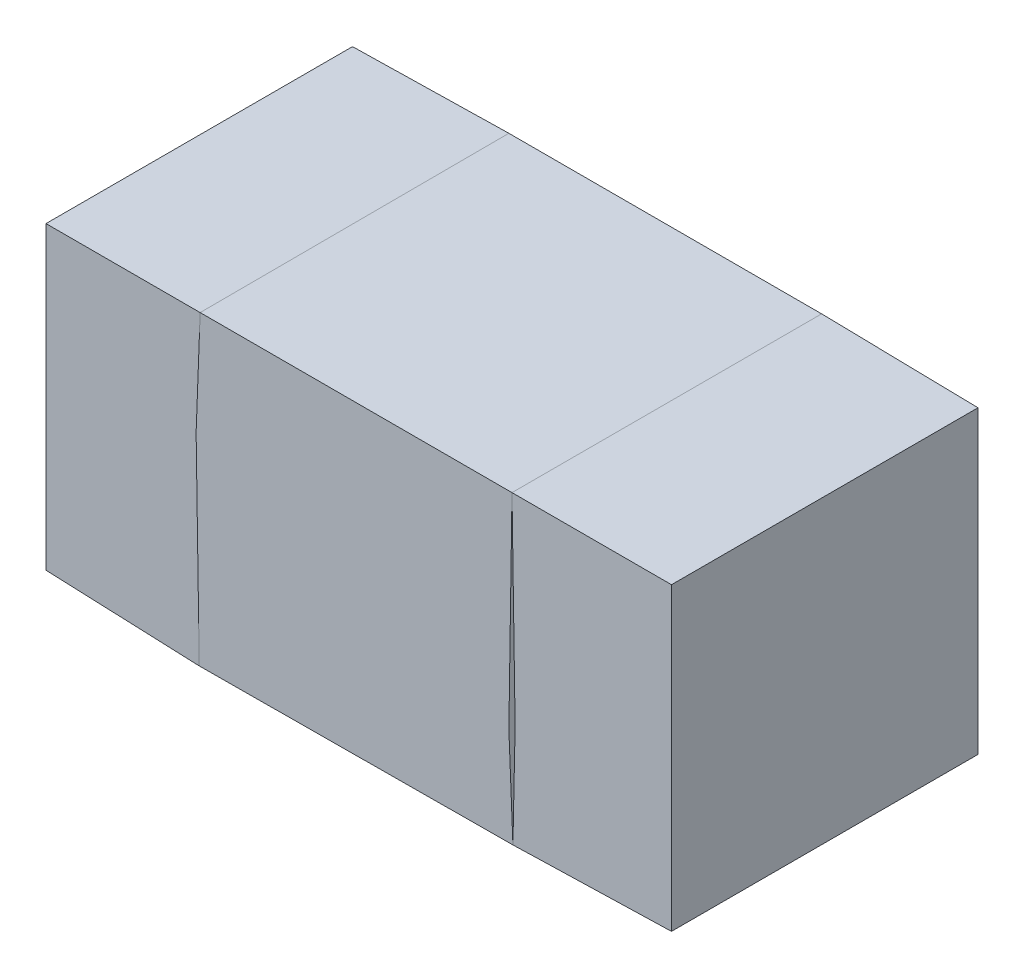
ISO-10303-21;
HEADER;
FILE_DESCRIPTION(('STEP AP214'),'2;1');
FILE_NAME('part.step','',(''),(''),'','','');
FILE_SCHEMA(('AUTOMOTIVE_DESIGN { 1 0 10303 214 1 1 1 1 }'));
ENDSEC;
DATA;
#1=APPLICATION_CONTEXT('core data for automotive mechanical design processes');
#2=APPLICATION_PROTOCOL_DEFINITION('international standard','automotive_design',2000,#1);
#3=PRODUCT_CONTEXT('',#1,'mechanical');
#4=PRODUCT('Part','Part','',(#3));
#5=PRODUCT_RELATED_PRODUCT_CATEGORY('part','',(#4));
#6=PRODUCT_DEFINITION_FORMATION('','',#4);
#7=PRODUCT_DEFINITION_CONTEXT('part definition',#1,'design');
#8=PRODUCT_DEFINITION('design','',#6,#7);
#9=PRODUCT_DEFINITION_SHAPE('','',#8);
#10=(LENGTH_UNIT() NAMED_UNIT(*) SI_UNIT(.MILLI.,.METRE.));
#11=(NAMED_UNIT(*) PLANE_ANGLE_UNIT() SI_UNIT($,.RADIAN.));
#12=(NAMED_UNIT(*) SI_UNIT($,.STERADIAN.) SOLID_ANGLE_UNIT());
#13=UNCERTAINTY_MEASURE_WITH_UNIT(LENGTH_MEASURE(1.E-05),#10,'distance_accuracy_value','');
#14=(GEOMETRIC_REPRESENTATION_CONTEXT(3) GLOBAL_UNCERTAINTY_ASSIGNED_CONTEXT((#13)) GLOBAL_UNIT_ASSIGNED_CONTEXT((#10,
#11,#12)) REPRESENTATION_CONTEXT('',''));
#15=CARTESIAN_POINT('',(0.,0.,0.));
#16=DIRECTION('',(0.,0.,1.));
#17=DIRECTION('',(1.,0.,0.));
#18=AXIS2_PLACEMENT_3D('',#15,#16,#17);
#19=CARTESIAN_POINT('',(0.,0.,0.49));
#20=DIRECTION('',(0.,0.,-1.));
#21=DIRECTION('',(0.,-1.,0.));
#22=AXIS2_PLACEMENT_3D('',#19,#20,#21);
#23=PLANE('',#22);
#24=DIRECTION('',(0.,-1.,0.));
#25=VECTOR('',#24,1.);
#26=CARTESIAN_POINT('',(-0.25,0.24,0.49));
#27=LINE('',#26,#25);
#28=CARTESIAN_POINT('',(-0.25,0.243535533905932,0.493535533905933));
#29=VERTEX_POINT('',#28);
#30=CARTESIAN_POINT('',(-0.25,-0.245,0.495));
#31=VERTEX_POINT('',#30);
#32=EDGE_CURVE('E146',#29,#31,#27,.T.);
#33=ORIENTED_EDGE('',*,*,#32,.F.);
#34=DIRECTION('',(1.,0.,0.));
#35=VECTOR('',#34,1.);
#36=CARTESIAN_POINT('',(-0.25,0.24,0.49));
#37=LINE('',#36,#35);
#38=CARTESIAN_POINT('',(-0.5,0.24,0.49));
#39=VERTEX_POINT('',#38);
#40=EDGE_CURVE('E99',#39,#29,#37,.T.);
#41=ORIENTED_EDGE('',*,*,#40,.F.);
#42=DIRECTION('',(0.,1.,0.));
#43=VECTOR('',#42,1.);
#44=CARTESIAN_POINT('',(-0.5,0.24,0.49));
#45=LINE('',#44,#43);
#46=CARTESIAN_POINT('',(-0.5,-0.24,0.49));
#47=VERTEX_POINT('',#46);
#48=EDGE_CURVE('E29',#47,#39,#45,.T.);
#49=ORIENTED_EDGE('',*,*,#48,.F.);
#50=DIRECTION('',(-1.,0.,0.));
#51=VECTOR('',#50,1.);
#52=CARTESIAN_POINT('',(-0.25,-0.24,0.49));
#53=LINE('',#52,#51);
#54=EDGE_CURVE('E11',#31,#47,#53,.T.);
#55=ORIENTED_EDGE('',*,*,#54,.F.);
#56=EDGE_LOOP('',(#33,#41,#49,#55));
#57=FACE_BOUND('',#56,.T.);
#58=ADVANCED_FACE('F16',(#57),#23,.F.);
#59=CARTESIAN_POINT('',(-0.25,-0.24,0.49));
#60=DIRECTION('',(0.,-1.,0.));
#61=DIRECTION('',(-1.,0.,0.));
#62=AXIS2_PLACEMENT_3D('',#59,#60,#61);
#63=PLANE('',#62);
#64=DIRECTION('',(-1.,0.,0.));
#65=VECTOR('',#64,1.);
#66=CARTESIAN_POINT('',(-0.25,-0.24,0.));
#67=LINE('',#66,#65);
#68=CARTESIAN_POINT('',(-0.25,-0.245,0.));
#69=VERTEX_POINT('',#68);
#70=CARTESIAN_POINT('',(-0.5,-0.24,0.));
#71=VERTEX_POINT('',#70);
#72=EDGE_CURVE('E117',#69,#71,#67,.T.);
#73=ORIENTED_EDGE('',*,*,#72,.F.);
#74=CARTESIAN_POINT('',(-0.25,-0.25,0.495));
#75=DIRECTION('',(0.,0.,-1.));
#76=VECTOR('',#75,1.);
#77=LINE('',#74,#76);
#78=EDGE_CURVE('E142',#31,#69,#77,.T.);
#79=ORIENTED_EDGE('',*,*,#78,.F.);
#80=ORIENTED_EDGE('',*,*,#54,.T.);
#81=DIRECTION('',(0.,0.,-1.));
#82=VECTOR('',#81,1.);
#83=CARTESIAN_POINT('',(-0.5,-0.24,0.49));
#84=LINE('',#83,#82);
#85=EDGE_CURVE('E130',#47,#71,#84,.T.);
#86=ORIENTED_EDGE('',*,*,#85,.T.);
#87=EDGE_LOOP('',(#73,#79,#80,#86));
#88=FACE_BOUND('',#87,.T.);
#89=ADVANCED_FACE('F274',(#88),#63,.T.);
#90=CARTESIAN_POINT('',(-0.5,0.24,0.49));
#91=DIRECTION('',(-1.,0.,0.));
#92=DIRECTION('',(0.,0.,1.));
#93=AXIS2_PLACEMENT_3D('',#90,#91,#92);
#94=PLANE('',#93);
#95=DIRECTION('',(0.,1.,0.));
#96=VECTOR('',#95,1.);
#97=CARTESIAN_POINT('',(-0.5,0.24,0.));
#98=LINE('',#97,#96);
#99=CARTESIAN_POINT('',(-0.5,0.24,0.));
#100=VERTEX_POINT('',#99);
#101=EDGE_CURVE('E93',#71,#100,#98,.T.);
#102=ORIENTED_EDGE('',*,*,#101,.F.);
#103=ORIENTED_EDGE('',*,*,#85,.F.);
#104=ORIENTED_EDGE('',*,*,#48,.T.);
#105=DIRECTION('',(0.,0.,-1.));
#106=VECTOR('',#105,1.);
#107=CARTESIAN_POINT('',(-0.5,0.24,0.49));
#108=LINE('',#107,#106);
#109=EDGE_CURVE('E88',#39,#100,#108,.T.);
#110=ORIENTED_EDGE('',*,*,#109,.T.);
#111=EDGE_LOOP('',(#102,#103,#104,#110));
#112=FACE_BOUND('',#111,.T.);
#113=ADVANCED_FACE('F90',(#112),#94,.T.);
#114=CARTESIAN_POINT('',(-0.25,0.24,0.49));
#115=DIRECTION('',(0.,1.,0.));
#116=DIRECTION('',(1.,0.,0.));
#117=AXIS2_PLACEMENT_3D('',#114,#115,#116);
#118=PLANE('',#117);
#119=DIRECTION('',(1.,0.,0.));
#120=VECTOR('',#119,1.);
#121=CARTESIAN_POINT('',(-0.25,0.24,0.));
#122=LINE('',#121,#120);
#123=CARTESIAN_POINT('',(-0.25,0.245,0.));
#124=VERTEX_POINT('',#123);
#125=EDGE_CURVE('E104',#100,#124,#122,.T.);
#126=ORIENTED_EDGE('',*,*,#125,.F.);
#127=ORIENTED_EDGE('',*,*,#109,.F.);
#128=ORIENTED_EDGE('',*,*,#40,.T.);
#129=CARTESIAN_POINT('',(-0.25,0.24,0.493535533905933));
#130=DIRECTION('',(0.,0.,-1.));
#131=VECTOR('',#130,1.);
#132=LINE('',#129,#131);
#133=EDGE_CURVE('E107',#29,#124,#132,.T.);
#134=ORIENTED_EDGE('',*,*,#133,.T.);
#135=EDGE_LOOP('',(#126,#127,#128,#134));
#136=FACE_BOUND('',#135,.T.);
#137=ADVANCED_FACE('F105',(#136),#118,.T.);
#138=CARTESIAN_POINT('',(0.,0.,0.49));
#139=DIRECTION('',(0.,0.,1.));
#140=DIRECTION('',(1.,0.,0.));
#141=AXIS2_PLACEMENT_3D('',#138,#139,#140);
#142=PLANE('',#141);
#143=DIRECTION('',(0.,1.,0.));
#144=VECTOR('',#143,1.);
#145=CARTESIAN_POINT('',(0.25,0.24,0.49));
#146=LINE('',#145,#144);
#147=CARTESIAN_POINT('',(0.25,-0.243535533905933,0.493535533905933));
#148=VERTEX_POINT('',#147);
#149=CARTESIAN_POINT('',(0.25,0.245,0.495));
#150=VERTEX_POINT('',#149);
#151=EDGE_CURVE('E174',#148,#150,#146,.T.);
#152=ORIENTED_EDGE('',*,*,#151,.F.);
#153=DIRECTION('',(-1.,0.,0.));
#154=VECTOR('',#153,1.);
#155=CARTESIAN_POINT('',(0.25,-0.24,0.49));
#156=LINE('',#155,#154);
#157=CARTESIAN_POINT('',(0.5,-0.24,0.49));
#158=VERTEX_POINT('',#157);
#159=EDGE_CURVE('E134',#158,#148,#156,.T.);
#160=ORIENTED_EDGE('',*,*,#159,.F.);
#161=DIRECTION('',(0.,-1.,0.));
#162=VECTOR('',#161,1.);
#163=CARTESIAN_POINT('',(0.5,0.24,0.49));
#164=LINE('',#163,#162);
#165=CARTESIAN_POINT('',(0.5,0.24,0.49));
#166=VERTEX_POINT('',#165);
#167=EDGE_CURVE('E79',#166,#158,#164,.T.);
#168=ORIENTED_EDGE('',*,*,#167,.F.);
#169=DIRECTION('',(1.,0.,0.));
#170=VECTOR('',#169,1.);
#171=CARTESIAN_POINT('',(0.25,0.24,0.49));
#172=LINE('',#171,#170);
#173=EDGE_CURVE('E100',#150,#166,#172,.T.);
#174=ORIENTED_EDGE('',*,*,#173,.F.);
#175=EDGE_LOOP('',(#152,#160,#168,#174));
#176=FACE_BOUND('',#175,.T.);
#177=ADVANCED_FACE('F273',(#176),#142,.T.);
#178=CARTESIAN_POINT('',(0.25,0.24,0.49));
#179=DIRECTION('',(0.,1.,0.));
#180=DIRECTION('',(1.,0.,0.));
#181=AXIS2_PLACEMENT_3D('',#178,#179,#180);
#182=PLANE('',#181);
#183=DIRECTION('',(1.,0.,0.));
#184=VECTOR('',#183,1.);
#185=CARTESIAN_POINT('',(0.25,0.24,0.));
#186=LINE('',#185,#184);
#187=CARTESIAN_POINT('',(0.25,0.245,0.));
#188=VERTEX_POINT('',#187);
#189=CARTESIAN_POINT('',(0.5,0.24,0.));
#190=VERTEX_POINT('',#189);
#191=EDGE_CURVE('E211',#188,#190,#186,.T.);
#192=ORIENTED_EDGE('',*,*,#191,.F.);
#193=CARTESIAN_POINT('',(0.25,0.25,0.495));
#194=DIRECTION('',(0.,0.,-1.));
#195=VECTOR('',#194,1.);
#196=LINE('',#193,#195);
#197=EDGE_CURVE('E157',#150,#188,#196,.T.);
#198=ORIENTED_EDGE('',*,*,#197,.F.);
#199=ORIENTED_EDGE('',*,*,#173,.T.);
#200=DIRECTION('',(0.,0.,-1.));
#201=VECTOR('',#200,1.);
#202=CARTESIAN_POINT('',(0.5,0.24,0.49));
#203=LINE('',#202,#201);
#204=EDGE_CURVE('E190',#166,#190,#203,.T.);
#205=ORIENTED_EDGE('',*,*,#204,.T.);
#206=EDGE_LOOP('',(#192,#198,#199,#205));
#207=FACE_BOUND('',#206,.T.);
#208=ADVANCED_FACE('F302',(#207),#182,.T.);
#209=CARTESIAN_POINT('',(0.5,0.24,0.49));
#210=DIRECTION('',(1.,0.,0.));
#211=DIRECTION('',(0.,-1.,0.));
#212=AXIS2_PLACEMENT_3D('',#209,#210,#211);
#213=PLANE('',#212);
#214=DIRECTION('',(0.,-1.,0.));
#215=VECTOR('',#214,1.);
#216=CARTESIAN_POINT('',(0.5,0.24,0.));
#217=LINE('',#216,#215);
#218=CARTESIAN_POINT('',(0.5,-0.24,0.));
#219=VERTEX_POINT('',#218);
#220=EDGE_CURVE('E128',#190,#219,#217,.T.);
#221=ORIENTED_EDGE('',*,*,#220,.F.);
#222=ORIENTED_EDGE('',*,*,#204,.F.);
#223=ORIENTED_EDGE('',*,*,#167,.T.);
#224=DIRECTION('',(0.,0.,-1.));
#225=VECTOR('',#224,1.);
#226=CARTESIAN_POINT('',(0.5,-0.24,0.49));
#227=LINE('',#226,#225);
#228=EDGE_CURVE('E113',#158,#219,#227,.T.);
#229=ORIENTED_EDGE('',*,*,#228,.T.);
#230=EDGE_LOOP('',(#221,#222,#223,#229));
#231=FACE_BOUND('',#230,.T.);
#232=ADVANCED_FACE('F301',(#231),#213,.T.);
#233=CARTESIAN_POINT('',(0.25,-0.24,0.49));
#234=DIRECTION('',(0.,-1.,0.));
#235=DIRECTION('',(-1.,0.,0.));
#236=AXIS2_PLACEMENT_3D('',#233,#234,#235);
#237=PLANE('',#236);
#238=DIRECTION('',(-1.,0.,0.));
#239=VECTOR('',#238,1.);
#240=CARTESIAN_POINT('',(0.25,-0.24,0.));
#241=LINE('',#240,#239);
#242=CARTESIAN_POINT('',(0.25,-0.245,0.));
#243=VERTEX_POINT('',#242);
#244=EDGE_CURVE('E124',#219,#243,#241,.T.);
#245=ORIENTED_EDGE('',*,*,#244,.F.);
#246=ORIENTED_EDGE('',*,*,#228,.F.);
#247=ORIENTED_EDGE('',*,*,#159,.T.);
#248=CARTESIAN_POINT('',(0.25,-0.24,0.493535533905933));
#249=DIRECTION('',(0.,0.,-1.));
#250=VECTOR('',#249,1.);
#251=LINE('',#248,#250);
#252=EDGE_CURVE('E143',#148,#243,#251,.T.);
#253=ORIENTED_EDGE('',*,*,#252,.T.);
#254=EDGE_LOOP('',(#245,#246,#247,#253));
#255=FACE_BOUND('',#254,.T.);
#256=ADVANCED_FACE('F293',(#255),#237,.T.);
#257=CARTESIAN_POINT('',(0.,0.,0.));
#258=DIRECTION('',(0.,0.,1.));
#259=DIRECTION('',(1.,0.,0.));
#260=AXIS2_PLACEMENT_3D('',#257,#258,#259);
#261=PLANE('',#260);
#262=DIRECTION('',(-1.,0.,0.));
#263=VECTOR('',#262,1.);
#264=CARTESIAN_POINT('',(-0.25,0.25,0.));
#265=LINE('',#264,#263);
#266=EDGE_CURVE('E178',#188,#124,#265,.T.);
#267=ORIENTED_EDGE('',*,*,#266,.F.);
#268=ORIENTED_EDGE('',*,*,#191,.T.);
#269=ORIENTED_EDGE('',*,*,#220,.T.);
#270=ORIENTED_EDGE('',*,*,#244,.T.);
#271=DIRECTION('',(1.,0.,0.));
#272=VECTOR('',#271,1.);
#273=CARTESIAN_POINT('',(-0.25,-0.25,0.));
#274=LINE('',#273,#272);
#275=EDGE_CURVE('E150',#69,#243,#274,.T.);
#276=ORIENTED_EDGE('',*,*,#275,.F.);
#277=ORIENTED_EDGE('',*,*,#72,.T.);
#278=ORIENTED_EDGE('',*,*,#101,.T.);
#279=ORIENTED_EDGE('',*,*,#125,.T.);
#280=EDGE_LOOP('',(#267,#268,#269,#270,#276,#277,#278,#279));
#281=FACE_BOUND('',#280,.T.);
#282=ADVANCED_FACE('F115',(#281),#261,.F.);
#283=CARTESIAN_POINT('',(0.,0.,0.5));
#284=DIRECTION('',(0.,0.,1.));
#285=DIRECTION('',(1.,0.,0.));
#286=AXIS2_PLACEMENT_3D('',#283,#284,#285);
#287=PLANE('',#286);
#288=DIRECTION('',(0.,1.,0.));
#289=VECTOR('',#288,1.);
#290=CARTESIAN_POINT('',(0.25,0.25,0.5));
#291=LINE('',#290,#289);
#292=EDGE_CURVE('E179',#148,#150,#291,.T.);
#293=ORIENTED_EDGE('',*,*,#292,.T.);
#294=DIRECTION('',(-1.,0.,0.));
#295=VECTOR('',#294,1.);
#296=CARTESIAN_POINT('',(-0.25,0.25,0.5));
#297=LINE('',#296,#295);
#298=EDGE_CURVE('E164',#150,#29,#297,.T.);
#299=ORIENTED_EDGE('',*,*,#298,.T.);
#300=DIRECTION('',(0.,-1.,0.));
#301=VECTOR('',#300,1.);
#302=CARTESIAN_POINT('',(-0.25,0.25,0.5));
#303=LINE('',#302,#301);
#304=EDGE_CURVE('E151',#29,#31,#303,.T.);
#305=ORIENTED_EDGE('',*,*,#304,.T.);
#306=DIRECTION('',(1.,0.,0.));
#307=VECTOR('',#306,1.);
#308=CARTESIAN_POINT('',(-0.25,-0.25,0.5));
#309=LINE('',#308,#307);
#310=EDGE_CURVE('E138',#31,#148,#309,.T.);
#311=ORIENTED_EDGE('',*,*,#310,.T.);
#312=EDGE_LOOP('',(#293,#299,#305,#311));
#313=FACE_BOUND('',#312,.T.);
#314=ADVANCED_FACE('F236',(#313),#287,.T.);
#315=CARTESIAN_POINT('',(-0.25,-0.25,0.5));
#316=DIRECTION('',(0.,1.,0.));
#317=DIRECTION('',(1.,0.,0.));
#318=AXIS2_PLACEMENT_3D('',#315,#316,#317);
#319=PLANE('',#318);
#320=ORIENTED_EDGE('',*,*,#275,.T.);
#321=ORIENTED_EDGE('',*,*,#252,.F.);
#322=ORIENTED_EDGE('',*,*,#310,.F.);
#323=ORIENTED_EDGE('',*,*,#78,.T.);
#324=EDGE_LOOP('',(#320,#321,#322,#323));
#325=FACE_BOUND('',#324,.T.);
#326=ADVANCED_FACE('F226',(#325),#319,.F.);
#327=CARTESIAN_POINT('',(-0.25,0.25,0.5));
#328=DIRECTION('',(1.,0.,0.));
#329=DIRECTION('',(0.,1.,0.));
#330=AXIS2_PLACEMENT_3D('',#327,#328,#329);
#331=PLANE('',#330);
#332=ORIENTED_EDGE('',*,*,#304,.F.);
#333=ORIENTED_EDGE('',*,*,#32,.T.);
#334=EDGE_LOOP('',(#332,#333));
#335=FACE_BOUND('',#334,.T.);
#336=ADVANCED_FACE('F18',(#335),#331,.F.);
#337=CARTESIAN_POINT('',(-0.25,0.25,0.5));
#338=DIRECTION('',(0.,-1.,0.));
#339=DIRECTION('',(0.,0.,-1.));
#340=AXIS2_PLACEMENT_3D('',#337,#338,#339);
#341=PLANE('',#340);
#342=ORIENTED_EDGE('',*,*,#266,.T.);
#343=ORIENTED_EDGE('',*,*,#133,.F.);
#344=ORIENTED_EDGE('',*,*,#298,.F.);
#345=ORIENTED_EDGE('',*,*,#197,.T.);
#346=EDGE_LOOP('',(#342,#343,#344,#345));
#347=FACE_BOUND('',#346,.T.);
#348=ADVANCED_FACE('F263',(#347),#341,.F.);
#349=CARTESIAN_POINT('',(0.25,0.25,0.5));
#350=DIRECTION('',(-1.,0.,0.));
#351=DIRECTION('',(0.,1.,0.));
#352=AXIS2_PLACEMENT_3D('',#349,#350,#351);
#353=PLANE('',#352);
#354=ORIENTED_EDGE('',*,*,#292,.F.);
#355=ORIENTED_EDGE('',*,*,#151,.T.);
#356=EDGE_LOOP('',(#354,#355));
#357=FACE_BOUND('',#356,.T.);
#358=ADVANCED_FACE('F239',(#357),#353,.F.);
#359=CLOSED_SHELL('',(#58,#89,#113,#137,#177,#208,#232,#256,#282,#314,#326,#336,#348,#358));
#360=MANIFOLD_SOLID_BREP('B1',#359);
#361=ADVANCED_BREP_SHAPE_REPRESENTATION('',(#18,#360),#14);
#362=SHAPE_DEFINITION_REPRESENTATION(#9,#361);
ENDSEC;
END-ISO-10303-21;
